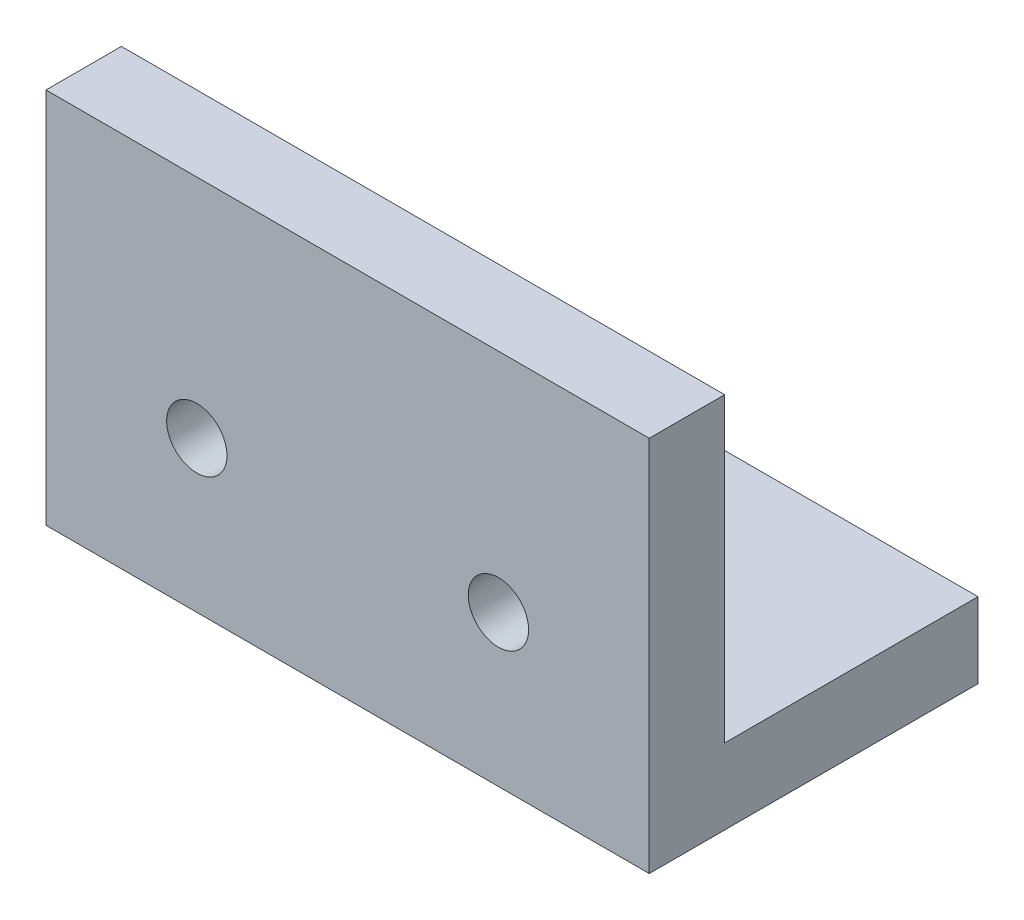
ISO-10303-21;
HEADER;
FILE_DESCRIPTION(('STEP AP214'),'2;1');
FILE_NAME('part.step','',(''),(''),'','','');
FILE_SCHEMA(('AUTOMOTIVE_DESIGN { 1 0 10303 214 1 1 1 1 }'));
ENDSEC;
DATA;
#1=APPLICATION_CONTEXT('core data for automotive mechanical design processes');
#2=APPLICATION_PROTOCOL_DEFINITION('international standard','automotive_design',2000,#1);
#3=PRODUCT_CONTEXT('',#1,'mechanical');
#4=PRODUCT('Part','Part','',(#3));
#5=PRODUCT_RELATED_PRODUCT_CATEGORY('part','',(#4));
#6=PRODUCT_DEFINITION_FORMATION('','',#4);
#7=PRODUCT_DEFINITION_CONTEXT('part definition',#1,'design');
#8=PRODUCT_DEFINITION('design','',#6,#7);
#9=PRODUCT_DEFINITION_SHAPE('','',#8);
#10=(LENGTH_UNIT() NAMED_UNIT(*) SI_UNIT(.MILLI.,.METRE.));
#11=(NAMED_UNIT(*) PLANE_ANGLE_UNIT() SI_UNIT($,.RADIAN.));
#12=(NAMED_UNIT(*) SI_UNIT($,.STERADIAN.) SOLID_ANGLE_UNIT());
#13=UNCERTAINTY_MEASURE_WITH_UNIT(LENGTH_MEASURE(1.E-05),#10,'distance_accuracy_value','');
#14=(GEOMETRIC_REPRESENTATION_CONTEXT(3) GLOBAL_UNCERTAINTY_ASSIGNED_CONTEXT((#13)) GLOBAL_UNIT_ASSIGNED_CONTEXT((#10,
#11,#12)) REPRESENTATION_CONTEXT('',''));
#15=CARTESIAN_POINT('',(0.,0.,0.));
#16=DIRECTION('',(0.,0.,1.));
#17=DIRECTION('',(1.,0.,0.));
#18=AXIS2_PLACEMENT_3D('',#15,#16,#17);
#19=CARTESIAN_POINT('',(25.4,0.,0.));
#20=DIRECTION('',(0.,-1.,0.));
#21=DIRECTION('',(0.,0.,-1.));
#22=AXIS2_PLACEMENT_3D('',#19,#20,#21);
#23=PLANE('',#22);
#24=DIRECTION('',(0.,0.,1.));
#25=VECTOR('',#24,1.);
#26=CARTESIAN_POINT('',(0.,0.,0.));
#27=LINE('',#26,#25);
#28=CARTESIAN_POINT('',(0.,0.,-10.668));
#29=VERTEX_POINT('',#28);
#30=CARTESIAN_POINT('',(0.,0.,0.));
#31=VERTEX_POINT('',#30);
#32=EDGE_CURVE('E117',#29,#31,#27,.T.);
#33=ORIENTED_EDGE('',*,*,#32,.T.);
#34=DIRECTION('',(-1.,0.,0.));
#35=VECTOR('',#34,1.);
#36=CARTESIAN_POINT('',(25.4,0.,0.));
#37=LINE('',#36,#35);
#38=CARTESIAN_POINT('',(25.4,0.,0.));
#39=VERTEX_POINT('',#38);
#40=EDGE_CURVE('E11',#39,#31,#37,.T.);
#41=ORIENTED_EDGE('',*,*,#40,.F.);
#42=DIRECTION('',(0.,0.,1.));
#43=VECTOR('',#42,1.);
#44=CARTESIAN_POINT('',(25.4,0.,0.));
#45=LINE('',#44,#43);
#46=CARTESIAN_POINT('',(25.4,0.,-10.668));
#47=VERTEX_POINT('',#46);
#48=EDGE_CURVE('E128',#47,#39,#45,.T.);
#49=ORIENTED_EDGE('',*,*,#48,.F.);
#50=DIRECTION('',(-1.,0.,0.));
#51=VECTOR('',#50,1.);
#52=CARTESIAN_POINT('',(25.4,0.,-10.668));
#53=LINE('',#52,#51);
#54=EDGE_CURVE('E113',#47,#29,#53,.T.);
#55=ORIENTED_EDGE('',*,*,#54,.T.);
#56=EDGE_LOOP('',(#33,#41,#49,#55));
#57=FACE_BOUND('',#56,.T.);
#58=ADVANCED_FACE('F33',(#57),#23,.F.);
#59=CARTESIAN_POINT('',(25.4,0.,0.));
#60=DIRECTION('',(0.,0.,1.));
#61=DIRECTION('',(1.,0.,0.));
#62=AXIS2_PLACEMENT_3D('',#59,#60,#61);
#63=PLANE('',#62);
#64=CARTESIAN_POINT('',(6.35,3.175,0.));
#65=DIRECTION('',(0.,0.,1.));
#66=DIRECTION('',(1.,0.,0.));
#67=AXIS2_PLACEMENT_3D('',#64,#65,#66);
#68=CIRCLE('',#67,1.27);
#69=CARTESIAN_POINT('',(7.62,3.175,0.));
#70=VERTEX_POINT('',#69);
#71=EDGE_CURVE('E121',#70,#70,#68,.T.);
#72=ORIENTED_EDGE('',*,*,#71,.T.);
#73=EDGE_LOOP('',(#72));
#74=FACE_BOUND('',#73,.T.);
#75=CARTESIAN_POINT('',(19.05,3.175,0.));
#76=DIRECTION('',(0.,0.,1.));
#77=DIRECTION('',(1.,0.,0.));
#78=AXIS2_PLACEMENT_3D('',#75,#76,#77);
#79=CIRCLE('',#78,1.27);
#80=CARTESIAN_POINT('',(20.32,3.175,0.));
#81=VERTEX_POINT('',#80);
#82=EDGE_CURVE('E177',#81,#81,#79,.T.);
#83=ORIENTED_EDGE('',*,*,#82,.T.);
#84=EDGE_LOOP('',(#83));
#85=FACE_BOUND('',#84,.T.);
#86=DIRECTION('',(0.,1.,0.));
#87=VECTOR('',#86,1.);
#88=CARTESIAN_POINT('',(0.,0.,0.));
#89=LINE('',#88,#87);
#90=CARTESIAN_POINT('',(0.,12.7,0.));
#91=VERTEX_POINT('',#90);
#92=EDGE_CURVE('E120',#31,#91,#89,.T.);
#93=ORIENTED_EDGE('',*,*,#92,.T.);
#94=DIRECTION('',(-1.,0.,0.));
#95=VECTOR('',#94,1.);
#96=CARTESIAN_POINT('',(25.4,12.7,0.));
#97=LINE('',#96,#95);
#98=CARTESIAN_POINT('',(25.4,12.7,0.));
#99=VERTEX_POINT('',#98);
#100=EDGE_CURVE('E41',#99,#91,#97,.T.);
#101=ORIENTED_EDGE('',*,*,#100,.F.);
#102=DIRECTION('',(0.,1.,0.));
#103=VECTOR('',#102,1.);
#104=CARTESIAN_POINT('',(25.4,0.,0.));
#105=LINE('',#104,#103);
#106=EDGE_CURVE('E86',#39,#99,#105,.T.);
#107=ORIENTED_EDGE('',*,*,#106,.F.);
#108=ORIENTED_EDGE('',*,*,#40,.T.);
#109=EDGE_LOOP('',(#93,#101,#107,#108));
#110=FACE_BOUND('',#109,.T.);
#111=ADVANCED_FACE('F152',(#74,#85,#110),#63,.F.);
#112=CARTESIAN_POINT('',(25.4,12.7,3.175));
#113=DIRECTION('',(0.,-1.,0.));
#114=DIRECTION('',(0.,0.,-1.));
#115=AXIS2_PLACEMENT_3D('',#112,#113,#114);
#116=PLANE('',#115);
#117=DIRECTION('',(0.,0.,1.));
#118=VECTOR('',#117,1.);
#119=CARTESIAN_POINT('',(0.,12.7,3.175));
#120=LINE('',#119,#118);
#121=CARTESIAN_POINT('',(0.,12.7,3.175));
#122=VERTEX_POINT('',#121);
#123=EDGE_CURVE('E123',#91,#122,#120,.T.);
#124=ORIENTED_EDGE('',*,*,#123,.T.);
#125=DIRECTION('',(-1.,0.,0.));
#126=VECTOR('',#125,1.);
#127=CARTESIAN_POINT('',(25.4,12.7,3.175));
#128=LINE('',#127,#126);
#129=CARTESIAN_POINT('',(25.4,12.7,3.175));
#130=VERTEX_POINT('',#129);
#131=EDGE_CURVE('E108',#130,#122,#128,.T.);
#132=ORIENTED_EDGE('',*,*,#131,.F.);
#133=DIRECTION('',(0.,0.,1.));
#134=VECTOR('',#133,1.);
#135=CARTESIAN_POINT('',(25.4,12.7,3.175));
#136=LINE('',#135,#134);
#137=EDGE_CURVE('E99',#99,#130,#136,.T.);
#138=ORIENTED_EDGE('',*,*,#137,.F.);
#139=ORIENTED_EDGE('',*,*,#100,.T.);
#140=EDGE_LOOP('',(#124,#132,#138,#139));
#141=FACE_BOUND('',#140,.T.);
#142=ADVANCED_FACE('F134',(#141),#116,.F.);
#143=CARTESIAN_POINT('',(25.4,-3.175,3.175));
#144=DIRECTION('',(0.,0.,-1.));
#145=DIRECTION('',(-1.,0.,0.));
#146=AXIS2_PLACEMENT_3D('',#143,#144,#145);
#147=PLANE('',#146);
#148=CARTESIAN_POINT('',(6.35,3.175,3.175));
#149=DIRECTION('',(0.,0.,1.));
#150=DIRECTION('',(1.,0.,0.));
#151=AXIS2_PLACEMENT_3D('',#148,#149,#150);
#152=CIRCLE('',#151,1.27);
#153=CARTESIAN_POINT('',(7.62,3.175,3.175));
#154=VERTEX_POINT('',#153);
#155=EDGE_CURVE('E171',#154,#154,#152,.T.);
#156=ORIENTED_EDGE('',*,*,#155,.F.);
#157=EDGE_LOOP('',(#156));
#158=FACE_BOUND('',#157,.T.);
#159=CARTESIAN_POINT('',(19.05,3.175,3.175));
#160=DIRECTION('',(0.,0.,1.));
#161=DIRECTION('',(1.,0.,0.));
#162=AXIS2_PLACEMENT_3D('',#159,#160,#161);
#163=CIRCLE('',#162,1.27);
#164=CARTESIAN_POINT('',(20.32,3.175,3.175));
#165=VERTEX_POINT('',#164);
#166=EDGE_CURVE('E174',#165,#165,#163,.T.);
#167=ORIENTED_EDGE('',*,*,#166,.F.);
#168=EDGE_LOOP('',(#167));
#169=FACE_BOUND('',#168,.T.);
#170=DIRECTION('',(0.,-1.,0.));
#171=VECTOR('',#170,1.);
#172=CARTESIAN_POINT('',(0.,-3.175,3.175));
#173=LINE('',#172,#171);
#174=CARTESIAN_POINT('',(0.,-3.175,3.175));
#175=VERTEX_POINT('',#174);
#176=EDGE_CURVE('E107',#122,#175,#173,.T.);
#177=ORIENTED_EDGE('',*,*,#176,.T.);
#178=DIRECTION('',(-1.,0.,0.));
#179=VECTOR('',#178,1.);
#180=CARTESIAN_POINT('',(25.4,-3.175,3.175));
#181=LINE('',#180,#179);
#182=CARTESIAN_POINT('',(25.4,-3.175,3.175));
#183=VERTEX_POINT('',#182);
#184=EDGE_CURVE('E104',#183,#175,#181,.T.);
#185=ORIENTED_EDGE('',*,*,#184,.F.);
#186=DIRECTION('',(0.,-1.,0.));
#187=VECTOR('',#186,1.);
#188=CARTESIAN_POINT('',(25.4,-3.175,3.175));
#189=LINE('',#188,#187);
#190=EDGE_CURVE('E93',#130,#183,#189,.T.);
#191=ORIENTED_EDGE('',*,*,#190,.F.);
#192=ORIENTED_EDGE('',*,*,#131,.T.);
#193=EDGE_LOOP('',(#177,#185,#191,#192));
#194=FACE_BOUND('',#193,.T.);
#195=ADVANCED_FACE('F105',(#158,#169,#194),#147,.F.);
#196=CARTESIAN_POINT('',(25.4,-3.175,3.175));
#197=DIRECTION('',(0.,1.,0.));
#198=DIRECTION('',(0.,0.,1.));
#199=AXIS2_PLACEMENT_3D('',#196,#197,#198);
#200=PLANE('',#199);
#201=DIRECTION('',(0.,0.,-1.));
#202=VECTOR('',#201,1.);
#203=CARTESIAN_POINT('',(0.,-3.175,3.175));
#204=LINE('',#203,#202);
#205=CARTESIAN_POINT('',(0.,-3.175,-10.668));
#206=VERTEX_POINT('',#205);
#207=EDGE_CURVE('E72',#175,#206,#204,.T.);
#208=ORIENTED_EDGE('',*,*,#207,.T.);
#209=DIRECTION('',(-1.,0.,0.));
#210=VECTOR('',#209,1.);
#211=CARTESIAN_POINT('',(25.4,-3.175,-10.668));
#212=LINE('',#211,#210);
#213=CARTESIAN_POINT('',(25.4,-3.175,-10.668));
#214=VERTEX_POINT('',#213);
#215=EDGE_CURVE('E109',#214,#206,#212,.T.);
#216=ORIENTED_EDGE('',*,*,#215,.F.);
#217=DIRECTION('',(0.,0.,-1.));
#218=VECTOR('',#217,1.);
#219=CARTESIAN_POINT('',(25.4,-3.175,3.175));
#220=LINE('',#219,#218);
#221=EDGE_CURVE('E97',#183,#214,#220,.T.);
#222=ORIENTED_EDGE('',*,*,#221,.F.);
#223=ORIENTED_EDGE('',*,*,#184,.T.);
#224=EDGE_LOOP('',(#208,#216,#222,#223));
#225=FACE_BOUND('',#224,.T.);
#226=ADVANCED_FACE('F111',(#225),#200,.F.);
#227=CARTESIAN_POINT('',(25.4,0.,-10.668));
#228=DIRECTION('',(0.,0.,1.));
#229=DIRECTION('',(1.,0.,0.));
#230=AXIS2_PLACEMENT_3D('',#227,#228,#229);
#231=PLANE('',#230);
#232=DIRECTION('',(0.,1.,0.));
#233=VECTOR('',#232,1.);
#234=CARTESIAN_POINT('',(0.,0.,-10.668));
#235=LINE('',#234,#233);
#236=EDGE_CURVE('E78',#206,#29,#235,.T.);
#237=ORIENTED_EDGE('',*,*,#236,.T.);
#238=ORIENTED_EDGE('',*,*,#54,.F.);
#239=DIRECTION('',(0.,1.,0.));
#240=VECTOR('',#239,1.);
#241=CARTESIAN_POINT('',(25.4,0.,-10.668));
#242=LINE('',#241,#240);
#243=EDGE_CURVE('E49',#214,#47,#242,.T.);
#244=ORIENTED_EDGE('',*,*,#243,.F.);
#245=ORIENTED_EDGE('',*,*,#215,.T.);
#246=EDGE_LOOP('',(#237,#238,#244,#245));
#247=FACE_BOUND('',#246,.T.);
#248=ADVANCED_FACE('F141',(#247),#231,.F.);
#249=CARTESIAN_POINT('',(25.4,0.,0.));
#250=DIRECTION('',(-1.,0.,0.));
#251=DIRECTION('',(0.,0.,1.));
#252=AXIS2_PLACEMENT_3D('',#249,#250,#251);
#253=PLANE('',#252);
#254=ORIENTED_EDGE('',*,*,#48,.T.);
#255=ORIENTED_EDGE('',*,*,#106,.T.);
#256=ORIENTED_EDGE('',*,*,#137,.T.);
#257=ORIENTED_EDGE('',*,*,#190,.T.);
#258=ORIENTED_EDGE('',*,*,#221,.T.);
#259=ORIENTED_EDGE('',*,*,#243,.T.);
#260=EDGE_LOOP('',(#254,#255,#256,#257,#258,#259));
#261=FACE_BOUND('',#260,.T.);
#262=ADVANCED_FACE('F95',(#261),#253,.F.);
#263=CARTESIAN_POINT('',(0.,0.,0.));
#264=DIRECTION('',(-1.,0.,0.));
#265=DIRECTION('',(0.,0.,1.));
#266=AXIS2_PLACEMENT_3D('',#263,#264,#265);
#267=PLANE('',#266);
#268=ORIENTED_EDGE('',*,*,#32,.F.);
#269=ORIENTED_EDGE('',*,*,#236,.F.);
#270=ORIENTED_EDGE('',*,*,#207,.F.);
#271=ORIENTED_EDGE('',*,*,#176,.F.);
#272=ORIENTED_EDGE('',*,*,#123,.F.);
#273=ORIENTED_EDGE('',*,*,#92,.F.);
#274=EDGE_LOOP('',(#268,#269,#270,#271,#272,#273));
#275=FACE_BOUND('',#274,.T.);
#276=ADVANCED_FACE('F137',(#275),#267,.T.);
#277=CARTESIAN_POINT('',(19.05,3.175,-22.225));
#278=DIRECTION('',(0.,0.,1.));
#279=DIRECTION('',(1.,0.,0.));
#280=AXIS2_PLACEMENT_3D('',#277,#278,#279);
#281=CYLINDRICAL_SURFACE('',#280,1.27);
#282=ORIENTED_EDGE('',*,*,#166,.T.);
#283=EDGE_LOOP('',(#282));
#284=FACE_BOUND('',#283,.T.);
#285=ORIENTED_EDGE('',*,*,#82,.F.);
#286=EDGE_LOOP('',(#285));
#287=FACE_BOUND('',#286,.T.);
#288=ADVANCED_FACE('F188',(#284,#287),#281,.F.);
#289=CARTESIAN_POINT('',(6.35,3.175,-22.225));
#290=DIRECTION('',(0.,0.,1.));
#291=DIRECTION('',(1.,0.,0.));
#292=AXIS2_PLACEMENT_3D('',#289,#290,#291);
#293=CYLINDRICAL_SURFACE('',#292,1.27);
#294=ORIENTED_EDGE('',*,*,#155,.T.);
#295=EDGE_LOOP('',(#294));
#296=FACE_BOUND('',#295,.T.);
#297=ORIENTED_EDGE('',*,*,#71,.F.);
#298=EDGE_LOOP('',(#297));
#299=FACE_BOUND('',#298,.T.);
#300=ADVANCED_FACE('F186',(#296,#299),#293,.F.);
#301=CLOSED_SHELL('',(#58,#111,#142,#195,#226,#248,#262,#276,#288,#300));
#302=MANIFOLD_SOLID_BREP('B2',#301);
#303=ADVANCED_BREP_SHAPE_REPRESENTATION('',(#18,#302),#14);
#304=SHAPE_DEFINITION_REPRESENTATION(#9,#303);
ENDSEC;
END-ISO-10303-21;
